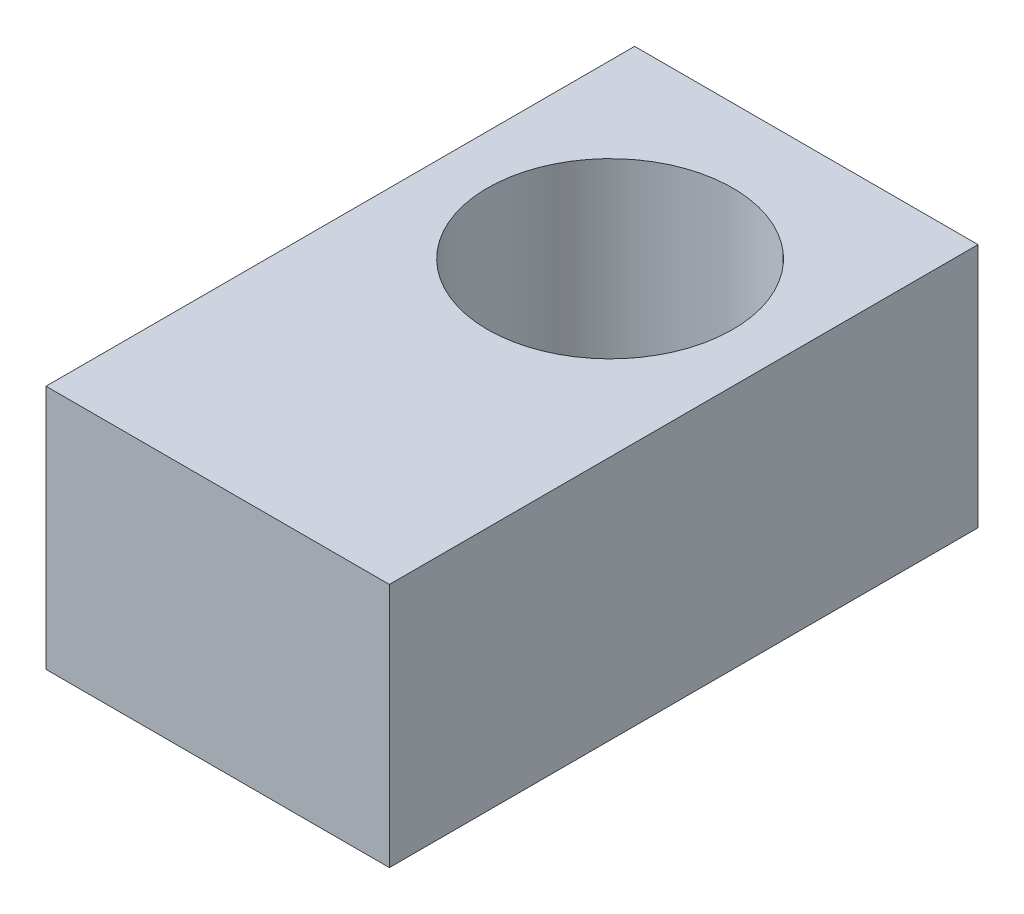
ISO-10303-21;
HEADER;
FILE_DESCRIPTION(('STEP AP214'),'2;1');
FILE_NAME('part.step','',(''),(''),'','','');
FILE_SCHEMA(('AUTOMOTIVE_DESIGN { 1 0 10303 214 1 1 1 1 }'));
ENDSEC;
DATA;
#1=APPLICATION_CONTEXT('core data for automotive mechanical design processes');
#2=APPLICATION_PROTOCOL_DEFINITION('international standard','automotive_design',2000,#1);
#3=PRODUCT_CONTEXT('',#1,'mechanical');
#4=PRODUCT('Part','Part','',(#3));
#5=PRODUCT_RELATED_PRODUCT_CATEGORY('part','',(#4));
#6=PRODUCT_DEFINITION_FORMATION('','',#4);
#7=PRODUCT_DEFINITION_CONTEXT('part definition',#1,'design');
#8=PRODUCT_DEFINITION('design','',#6,#7);
#9=PRODUCT_DEFINITION_SHAPE('','',#8);
#10=(LENGTH_UNIT() NAMED_UNIT(*) SI_UNIT(.MILLI.,.METRE.));
#11=(NAMED_UNIT(*) PLANE_ANGLE_UNIT() SI_UNIT($,.RADIAN.));
#12=(NAMED_UNIT(*) SI_UNIT($,.STERADIAN.) SOLID_ANGLE_UNIT());
#13=UNCERTAINTY_MEASURE_WITH_UNIT(LENGTH_MEASURE(1.E-05),#10,'distance_accuracy_value','');
#14=(GEOMETRIC_REPRESENTATION_CONTEXT(3) GLOBAL_UNCERTAINTY_ASSIGNED_CONTEXT((#13)) GLOBAL_UNIT_ASSIGNED_CONTEXT((#10,
#11,#12)) REPRESENTATION_CONTEXT('',''));
#15=CARTESIAN_POINT('',(0.,0.,0.));
#16=DIRECTION('',(0.,0.,1.));
#17=DIRECTION('',(1.,0.,0.));
#18=AXIS2_PLACEMENT_3D('',#15,#16,#17);
#19=CARTESIAN_POINT('',(3.5,5.,-6.));
#20=DIRECTION('',(-1.,0.,0.));
#21=DIRECTION('',(0.,0.,1.));
#22=AXIS2_PLACEMENT_3D('',#19,#20,#21);
#23=PLANE('',#22);
#24=DIRECTION('',(0.,0.,-1.));
#25=VECTOR('',#24,1.);
#26=CARTESIAN_POINT('',(3.5,0.,-6.));
#27=LINE('',#26,#25);
#28=CARTESIAN_POINT('',(3.5,0.,6.));
#29=VERTEX_POINT('',#28);
#30=CARTESIAN_POINT('',(3.5,0.,-6.));
#31=VERTEX_POINT('',#30);
#32=EDGE_CURVE('E96',#29,#31,#27,.T.);
#33=ORIENTED_EDGE('',*,*,#32,.T.);
#34=DIRECTION('',(0.,-1.,0.));
#35=VECTOR('',#34,1.);
#36=CARTESIAN_POINT('',(3.5,5.,-6.));
#37=LINE('',#36,#35);
#38=CARTESIAN_POINT('',(3.5,5.,-6.));
#39=VERTEX_POINT('',#38);
#40=EDGE_CURVE('E11',#39,#31,#37,.T.);
#41=ORIENTED_EDGE('',*,*,#40,.F.);
#42=DIRECTION('',(0.,0.,-1.));
#43=VECTOR('',#42,1.);
#44=CARTESIAN_POINT('',(3.5,5.,-6.));
#45=LINE('',#44,#43);
#46=CARTESIAN_POINT('',(3.5,5.,6.));
#47=VERTEX_POINT('',#46);
#48=EDGE_CURVE('E84',#47,#39,#45,.T.);
#49=ORIENTED_EDGE('',*,*,#48,.F.);
#50=DIRECTION('',(0.,-1.,0.));
#51=VECTOR('',#50,1.);
#52=CARTESIAN_POINT('',(3.5,5.,6.));
#53=LINE('',#52,#51);
#54=EDGE_CURVE('E92',#47,#29,#53,.T.);
#55=ORIENTED_EDGE('',*,*,#54,.T.);
#56=EDGE_LOOP('',(#33,#41,#49,#55));
#57=FACE_BOUND('',#56,.T.);
#58=ADVANCED_FACE('F33',(#57),#23,.F.);
#59=CARTESIAN_POINT('',(-3.5,5.,-6.));
#60=DIRECTION('',(0.,0.,1.));
#61=DIRECTION('',(1.,0.,0.));
#62=AXIS2_PLACEMENT_3D('',#59,#60,#61);
#63=PLANE('',#62);
#64=DIRECTION('',(-1.,0.,0.));
#65=VECTOR('',#64,1.);
#66=CARTESIAN_POINT('',(-3.5,0.,-6.));
#67=LINE('',#66,#65);
#68=CARTESIAN_POINT('',(-3.5,0.,-6.));
#69=VERTEX_POINT('',#68);
#70=EDGE_CURVE('E88',#31,#69,#67,.T.);
#71=ORIENTED_EDGE('',*,*,#70,.T.);
#72=DIRECTION('',(0.,-1.,0.));
#73=VECTOR('',#72,1.);
#74=CARTESIAN_POINT('',(-3.5,5.,-6.));
#75=LINE('',#74,#73);
#76=CARTESIAN_POINT('',(-3.5,5.,-6.));
#77=VERTEX_POINT('',#76);
#78=EDGE_CURVE('E41',#77,#69,#75,.T.);
#79=ORIENTED_EDGE('',*,*,#78,.F.);
#80=DIRECTION('',(-1.,0.,0.));
#81=VECTOR('',#80,1.);
#82=CARTESIAN_POINT('',(-3.5,5.,-6.));
#83=LINE('',#82,#81);
#84=EDGE_CURVE('E79',#39,#77,#83,.T.);
#85=ORIENTED_EDGE('',*,*,#84,.F.);
#86=ORIENTED_EDGE('',*,*,#40,.T.);
#87=EDGE_LOOP('',(#71,#79,#85,#86));
#88=FACE_BOUND('',#87,.T.);
#89=ADVANCED_FACE('F87',(#88),#63,.F.);
#90=CARTESIAN_POINT('',(-3.5,5.,-6.));
#91=DIRECTION('',(1.,0.,0.));
#92=DIRECTION('',(0.,0.,-1.));
#93=AXIS2_PLACEMENT_3D('',#90,#91,#92);
#94=PLANE('',#93);
#95=DIRECTION('',(0.,0.,1.));
#96=VECTOR('',#95,1.);
#97=CARTESIAN_POINT('',(-3.5,0.,-6.));
#98=LINE('',#97,#96);
#99=CARTESIAN_POINT('',(-3.5,0.,6.));
#100=VERTEX_POINT('',#99);
#101=EDGE_CURVE('E66',#69,#100,#98,.T.);
#102=ORIENTED_EDGE('',*,*,#101,.T.);
#103=DIRECTION('',(0.,-1.,0.));
#104=VECTOR('',#103,1.);
#105=CARTESIAN_POINT('',(-3.5,5.,6.));
#106=LINE('',#105,#104);
#107=CARTESIAN_POINT('',(-3.5,5.,6.));
#108=VERTEX_POINT('',#107);
#109=EDGE_CURVE('E89',#108,#100,#106,.T.);
#110=ORIENTED_EDGE('',*,*,#109,.F.);
#111=DIRECTION('',(0.,0.,1.));
#112=VECTOR('',#111,1.);
#113=CARTESIAN_POINT('',(-3.5,5.,-6.));
#114=LINE('',#113,#112);
#115=EDGE_CURVE('E82',#77,#108,#114,.T.);
#116=ORIENTED_EDGE('',*,*,#115,.F.);
#117=ORIENTED_EDGE('',*,*,#78,.T.);
#118=EDGE_LOOP('',(#102,#110,#116,#117));
#119=FACE_BOUND('',#118,.T.);
#120=ADVANCED_FACE('F90',(#119),#94,.F.);
#121=CARTESIAN_POINT('',(-3.5,5.,6.));
#122=DIRECTION('',(0.,0.,-1.));
#123=DIRECTION('',(-1.,0.,0.));
#124=AXIS2_PLACEMENT_3D('',#121,#122,#123);
#125=PLANE('',#124);
#126=DIRECTION('',(1.,0.,0.));
#127=VECTOR('',#126,1.);
#128=CARTESIAN_POINT('',(-3.5,0.,6.));
#129=LINE('',#128,#127);
#130=EDGE_CURVE('E72',#100,#29,#129,.T.);
#131=ORIENTED_EDGE('',*,*,#130,.T.);
#132=ORIENTED_EDGE('',*,*,#54,.F.);
#133=DIRECTION('',(1.,0.,0.));
#134=VECTOR('',#133,1.);
#135=CARTESIAN_POINT('',(-3.5,5.,6.));
#136=LINE('',#135,#134);
#137=EDGE_CURVE('E49',#108,#47,#136,.T.);
#138=ORIENTED_EDGE('',*,*,#137,.F.);
#139=ORIENTED_EDGE('',*,*,#109,.T.);
#140=EDGE_LOOP('',(#131,#132,#138,#139));
#141=FACE_BOUND('',#140,.T.);
#142=ADVANCED_FACE('F104',(#141),#125,.F.);
#143=CARTESIAN_POINT('',(0.,5.,0.));
#144=DIRECTION('',(0.,1.,0.));
#145=DIRECTION('',(0.,0.,1.));
#146=AXIS2_PLACEMENT_3D('',#143,#144,#145);
#147=PLANE('',#146);
#148=CARTESIAN_POINT('',(0.,5.,-2.));
#149=DIRECTION('',(0.,1.,0.));
#150=DIRECTION('',(0.,0.,1.));
#151=AXIS2_PLACEMENT_3D('',#148,#149,#150);
#152=CIRCLE('',#151,2.5);
#153=CARTESIAN_POINT('',(0.,5.,0.500000000000001));
#154=VERTEX_POINT('',#153);
#155=EDGE_CURVE('E112',#154,#154,#152,.T.);
#156=ORIENTED_EDGE('',*,*,#155,.F.);
#157=EDGE_LOOP('',(#156));
#158=FACE_BOUND('',#157,.T.);
#159=ORIENTED_EDGE('',*,*,#48,.T.);
#160=ORIENTED_EDGE('',*,*,#84,.T.);
#161=ORIENTED_EDGE('',*,*,#115,.T.);
#162=ORIENTED_EDGE('',*,*,#137,.T.);
#163=EDGE_LOOP('',(#159,#160,#161,#162));
#164=FACE_BOUND('',#163,.T.);
#165=ADVANCED_FACE('F80',(#158,#164),#147,.T.);
#166=CARTESIAN_POINT('',(0.,0.,0.));
#167=DIRECTION('',(0.,1.,0.));
#168=DIRECTION('',(0.,0.,1.));
#169=AXIS2_PLACEMENT_3D('',#166,#167,#168);
#170=PLANE('',#169);
#171=CARTESIAN_POINT('',(0.,0.,-2.));
#172=DIRECTION('',(0.,1.,0.));
#173=DIRECTION('',(0.,0.,1.));
#174=AXIS2_PLACEMENT_3D('',#171,#172,#173);
#175=CIRCLE('',#174,2.5);
#176=CARTESIAN_POINT('',(0.,0.,0.500000000000001));
#177=VERTEX_POINT('',#176);
#178=EDGE_CURVE('E99',#177,#177,#175,.F.);
#179=ORIENTED_EDGE('',*,*,#178,.F.);
#180=EDGE_LOOP('',(#179));
#181=FACE_BOUND('',#180,.T.);
#182=ORIENTED_EDGE('',*,*,#32,.F.);
#183=ORIENTED_EDGE('',*,*,#130,.F.);
#184=ORIENTED_EDGE('',*,*,#101,.F.);
#185=ORIENTED_EDGE('',*,*,#70,.F.);
#186=EDGE_LOOP('',(#182,#183,#184,#185));
#187=FACE_BOUND('',#186,.T.);
#188=ADVANCED_FACE('F107',(#181,#187),#170,.F.);
#189=CARTESIAN_POINT('',(0.,-0.00100000000000013,-2.));
#190=DIRECTION('',(0.,1.,0.));
#191=DIRECTION('',(0.,0.,1.));
#192=AXIS2_PLACEMENT_3D('',#189,#190,#191);
#193=CYLINDRICAL_SURFACE('',#192,2.5);
#194=ORIENTED_EDGE('',*,*,#155,.T.);
#195=EDGE_LOOP('',(#194));
#196=FACE_BOUND('',#195,.T.);
#197=ORIENTED_EDGE('',*,*,#178,.T.);
#198=EDGE_LOOP('',(#197));
#199=FACE_BOUND('',#198,.T.);
#200=ADVANCED_FACE('F116',(#196,#199),#193,.F.);
#201=CLOSED_SHELL('',(#58,#89,#120,#142,#165,#188,#200));
#202=MANIFOLD_SOLID_BREP('B2',#201);
#203=ADVANCED_BREP_SHAPE_REPRESENTATION('',(#18,#202),#14);
#204=SHAPE_DEFINITION_REPRESENTATION(#9,#203);
ENDSEC;
END-ISO-10303-21;
